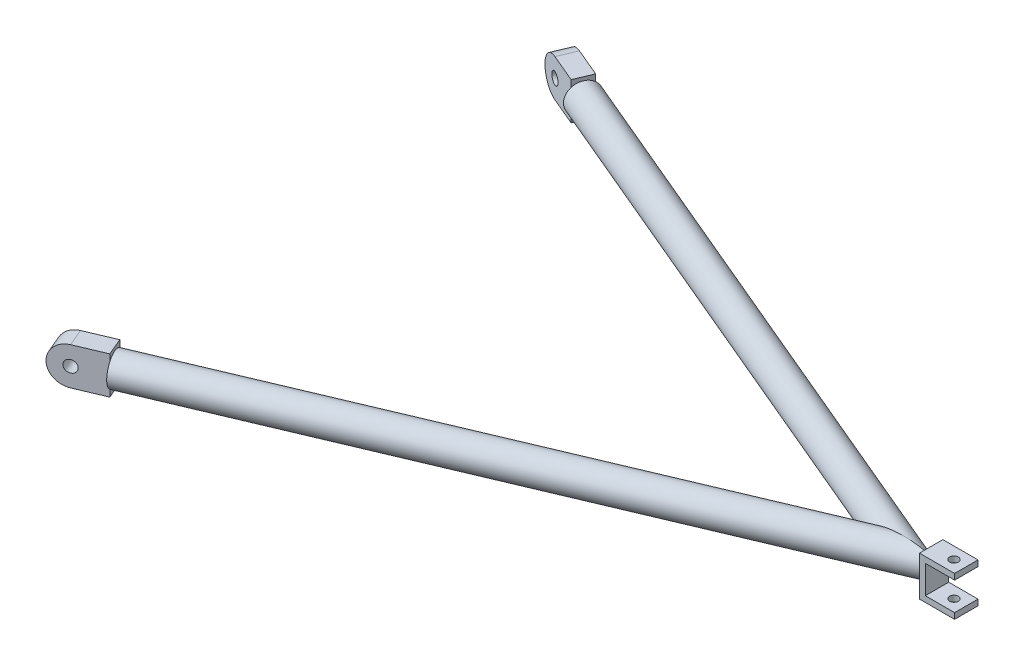
ISO-10303-21;
HEADER;
FILE_DESCRIPTION(('STEP AP214'),'2;1');
FILE_NAME('part.step','',(''),(''),'','','');
FILE_SCHEMA(('AUTOMOTIVE_DESIGN { 1 0 10303 214 1 1 1 1 }'));
ENDSEC;
DATA;
#1=APPLICATION_CONTEXT('core data for automotive mechanical design processes');
#2=APPLICATION_PROTOCOL_DEFINITION('international standard','automotive_design',2000,#1);
#3=PRODUCT_CONTEXT('',#1,'mechanical');
#4=PRODUCT('Part','Part','',(#3));
#5=PRODUCT_RELATED_PRODUCT_CATEGORY('part','',(#4));
#6=PRODUCT_DEFINITION_FORMATION('','',#4);
#7=PRODUCT_DEFINITION_CONTEXT('part definition',#1,'design');
#8=PRODUCT_DEFINITION('design','',#6,#7);
#9=PRODUCT_DEFINITION_SHAPE('','',#8);
#10=(LENGTH_UNIT() NAMED_UNIT(*) SI_UNIT(.MILLI.,.METRE.));
#11=(NAMED_UNIT(*) PLANE_ANGLE_UNIT() SI_UNIT($,.RADIAN.));
#12=(NAMED_UNIT(*) SI_UNIT($,.STERADIAN.) SOLID_ANGLE_UNIT());
#13=UNCERTAINTY_MEASURE_WITH_UNIT(LENGTH_MEASURE(1.E-05),#10,'distance_accuracy_value','');
#14=(GEOMETRIC_REPRESENTATION_CONTEXT(3) GLOBAL_UNCERTAINTY_ASSIGNED_CONTEXT((#13)) GLOBAL_UNIT_ASSIGNED_CONTEXT((#10,
#11,#12)) REPRESENTATION_CONTEXT('',''));
#15=CARTESIAN_POINT('',(0.,0.,0.));
#16=DIRECTION('',(0.,0.,1.));
#17=DIRECTION('',(1.,0.,0.));
#18=AXIS2_PLACEMENT_3D('',#15,#16,#17);
#19=CARTESIAN_POINT('',(-315.908511281352,0.,133.35));
#20=DIRECTION('',(0.921284663987611,0.,-0.388888888888889));
#21=DIRECTION('',(-0.388888888888889,0.,-0.921284663987611));
#22=AXIS2_PLACEMENT_3D('',#19,#20,#21);
#23=CYLINDRICAL_SURFACE('',#22,8.25500000000001);
#24=CARTESIAN_POINT('',(14.8771428571428,0.,-6.27987828486565));
#25=DIRECTION('',(-1.,0.,0.));
#26=DIRECTION('',(0.,0.,-1.));
#27=AXIS2_PLACEMENT_3D('',#24,#25,#26);
#28=ELLIPSE('',#27,8.96031413816198,8.25500000000001);
#29=CARTESIAN_POINT('',(14.8771428571428,5.8883250516238,0.));
#30=VERTEX_POINT('',#29);
#31=CARTESIAN_POINT('',(14.8771428571428,-5.8883250516238,0.));
#32=VERTEX_POINT('',#31);
#33=EDGE_CURVE('E70',#30,#32,#28,.F.);
#34=ORIENTED_EDGE('',*,*,#33,.F.);
#35=CARTESIAN_POINT('',(0.,0.,0.));
#36=DIRECTION('',(0.,0.,-1.));
#37=DIRECTION('',(1.,0.,0.));
#38=AXIS2_PLACEMENT_3D('',#35,#36,#37);
#39=ELLIPSE('',#38,21.2271428571429,8.25500000000001);
#40=EDGE_CURVE('E73',#30,#32,#39,.F.);
#41=ORIENTED_EDGE('',*,*,#40,.T.);
#42=EDGE_LOOP('',(#34,#41));
#43=FACE_BOUND('',#42,.T.);
#44=CARTESIAN_POINT('',(-300.93210778357,0.,127.028222222222));
#45=DIRECTION('',(-0.92128466398761,0.,0.388888888888891));
#46=DIRECTION('',(0.388888888888891,0.,0.92128466398761));
#47=AXIS2_PLACEMENT_3D('',#44,#45,#46);
#48=CIRCLE('',#47,8.25500000000001);
#49=CARTESIAN_POINT('',(-302.907663339125,6.50681373638437,122.348096129165));
#50=VERTEX_POINT('',#49);
#51=CARTESIAN_POINT('',(-298.956552228014,6.50681373638437,131.708348315279));
#52=VERTEX_POINT('',#51);
#53=EDGE_CURVE('E222',#50,#52,#48,.F.);
#54=ORIENTED_EDGE('',*,*,#53,.T.);
#55=CARTESIAN_POINT('',(-300.93210778357,0.,127.028222222222));
#56=DIRECTION('',(-0.92128466398761,0.,0.388888888888891));
#57=DIRECTION('',(0.388888888888891,0.,0.92128466398761));
#58=AXIS2_PLACEMENT_3D('',#55,#56,#57);
#59=CIRCLE('',#58,8.25500000000001);
#60=CARTESIAN_POINT('',(-298.956552228014,-6.50681373638435,131.708348315279));
#61=VERTEX_POINT('',#60);
#62=EDGE_CURVE('E208',#52,#61,#59,.F.);
#63=ORIENTED_EDGE('',*,*,#62,.T.);
#64=CARTESIAN_POINT('',(-302.907663339125,-6.50681373638435,122.348096129165));
#65=VERTEX_POINT('',#64);
#66=EDGE_CURVE('E231',#61,#65,#48,.F.);
#67=ORIENTED_EDGE('',*,*,#66,.T.);
#68=CARTESIAN_POINT('',(-300.93210778357,0.,127.028222222222));
#69=DIRECTION('',(-0.92128466398761,0.,0.388888888888891));
#70=DIRECTION('',(0.388888888888891,0.,0.92128466398761));
#71=AXIS2_PLACEMENT_3D('',#68,#69,#70);
#72=CIRCLE('',#71,8.25500000000001);
#73=EDGE_CURVE('E230',#65,#50,#72,.F.);
#74=ORIENTED_EDGE('',*,*,#73,.T.);
#75=EDGE_LOOP('',(#54,#63,#67,#74));
#76=FACE_BOUND('',#75,.T.);
#77=ADVANCED_FACE('F56',(#43,#76),#23,.T.);
#78=CARTESIAN_POINT('',(19.9106800537004,0.,8.40461428022842));
#79=DIRECTION('',(-0.921284663987611,0.,-0.388888888888889));
#80=DIRECTION('',(-0.388888888888889,0.,0.921284663987611));
#81=AXIS2_PLACEMENT_3D('',#78,#79,#80);
#82=CYLINDRICAL_SURFACE('',#81,8.25500000000001);
#83=CARTESIAN_POINT('',(14.8771428571428,0.,6.27987828486565));
#84=DIRECTION('',(-1.,0.,0.));
#85=DIRECTION('',(0.,0.,-1.));
#86=AXIS2_PLACEMENT_3D('',#83,#84,#85);
#87=ELLIPSE('',#86,8.96031413816199,8.25500000000001);
#88=EDGE_CURVE('E350',#32,#30,#87,.F.);
#89=ORIENTED_EDGE('',*,*,#88,.F.);
#90=ORIENTED_EDGE('',*,*,#40,.F.);
#91=EDGE_LOOP('',(#89,#90));
#92=FACE_BOUND('',#91,.T.);
#93=CARTESIAN_POINT('',(-300.698101478916,0.,-126.929444444444));
#94=DIRECTION('',(-0.92128466398761,0.,-0.388888888888891));
#95=DIRECTION('',(-0.388888888888891,0.,0.92128466398761));
#96=AXIS2_PLACEMENT_3D('',#93,#94,#95);
#97=CIRCLE('',#96,8.25500000000001);
#98=CARTESIAN_POINT('',(-298.722545923361,6.50681373638441,-131.609570537501));
#99=VERTEX_POINT('',#98);
#100=CARTESIAN_POINT('',(-302.673657034472,6.50681373638435,-122.249318351387));
#101=VERTEX_POINT('',#100);
#102=EDGE_CURVE('E233',#99,#101,#97,.F.);
#103=ORIENTED_EDGE('',*,*,#102,.T.);
#104=CARTESIAN_POINT('',(-300.698101478916,0.,-126.929444444444));
#105=DIRECTION('',(-0.92128466398761,0.,-0.388888888888891));
#106=DIRECTION('',(-0.388888888888891,0.,0.92128466398761));
#107=AXIS2_PLACEMENT_3D('',#104,#105,#106);
#108=CIRCLE('',#107,8.25499999999998);
#109=CARTESIAN_POINT('',(-302.673657034472,-6.50681373638431,-122.249318351387));
#110=VERTEX_POINT('',#109);
#111=EDGE_CURVE('E245',#101,#110,#108,.F.);
#112=ORIENTED_EDGE('',*,*,#111,.T.);
#113=CARTESIAN_POINT('',(-298.722545923361,-6.50681373638437,-131.609570537501));
#114=VERTEX_POINT('',#113);
#115=EDGE_CURVE('E64',#110,#114,#97,.F.);
#116=ORIENTED_EDGE('',*,*,#115,.T.);
#117=CARTESIAN_POINT('',(-300.698101478916,0.,-126.929444444444));
#118=DIRECTION('',(-0.92128466398761,0.,-0.388888888888891));
#119=DIRECTION('',(-0.388888888888891,0.,0.92128466398761));
#120=AXIS2_PLACEMENT_3D('',#117,#118,#119);
#121=CIRCLE('',#120,8.25500000000002);
#122=EDGE_CURVE('E207',#114,#99,#121,.F.);
#123=ORIENTED_EDGE('',*,*,#122,.T.);
#124=EDGE_LOOP('',(#103,#112,#116,#123));
#125=FACE_BOUND('',#124,.T.);
#126=ADVANCED_FACE('F58',(#92,#125),#82,.T.);
#127=CARTESIAN_POINT('',(-302.673657034472,10.16,-122.249318351387));
#128=DIRECTION('',(-0.388888888888889,0.,0.921284663987611));
#129=DIRECTION('',(0.921284663987611,0.,0.388888888888889));
#130=AXIS2_PLACEMENT_3D('',#127,#128,#129);
#131=PLANE('',#130);
#132=CARTESIAN_POINT('',(-317.884066836907,0.,-128.669873906943));
#133=DIRECTION('',(-0.388888888888889,0.,0.921284663987611));
#134=DIRECTION('',(0.921284663987611,0.,0.388888888888889));
#135=AXIS2_PLACEMENT_3D('',#132,#133,#134);
#136=CIRCLE('',#135,3.17499999999999);
#137=CARTESIAN_POINT('',(-320.809145645068,0.,-129.904596129165));
#138=VERTEX_POINT('',#137);
#139=EDGE_CURVE('E516',#138,#138,#136,.T.);
#140=ORIENTED_EDGE('',*,*,#139,.F.);
#141=EDGE_LOOP('',(#140));
#142=FACE_BOUND('',#141,.T.);
#143=CARTESIAN_POINT('',(-317.884066836907,0.,-128.669873906943));
#144=DIRECTION('',(-0.388888888888889,0.,0.921284663987611));
#145=DIRECTION('',(0.921284663987611,0.,0.388888888888889));
#146=AXIS2_PLACEMENT_3D('',#143,#144,#145);
#147=CIRCLE('',#146,10.16);
#148=CARTESIAN_POINT('',(-317.884066836907,-10.16,-128.669873906943));
#149=VERTEX_POINT('',#148);
#150=CARTESIAN_POINT('',(-317.884066836907,10.16,-128.669873906943));
#151=VERTEX_POINT('',#150);
#152=EDGE_CURVE('E264',#149,#151,#147,.F.);
#153=ORIENTED_EDGE('',*,*,#152,.F.);
#154=DIRECTION('',(-0.921284663987611,0.,-0.388888888888889));
#155=VECTOR('',#154,1.);
#156=CARTESIAN_POINT('',(-302.673657034472,-10.16,-122.249318351387));
#157=LINE('',#156,#155);
#158=CARTESIAN_POINT('',(-302.673657034472,-10.16,-122.249318351387));
#159=VERTEX_POINT('',#158);
#160=EDGE_CURVE('E226',#159,#149,#157,.T.);
#161=ORIENTED_EDGE('',*,*,#160,.F.);
#162=DIRECTION('',(0.,1.,0.));
#163=VECTOR('',#162,1.);
#164=CARTESIAN_POINT('',(-302.673657034472,10.16,-122.249318351387));
#165=LINE('',#164,#163);
#166=EDGE_CURVE('E252',#159,#110,#165,.T.);
#167=ORIENTED_EDGE('',*,*,#166,.T.);
#168=DIRECTION('',(0.,1.,0.));
#169=VECTOR('',#168,1.);
#170=CARTESIAN_POINT('',(-302.673657034472,6.50681373638435,-122.249318351387));
#171=LINE('',#170,#169);
#172=EDGE_CURVE('E257',#110,#101,#171,.T.);
#173=ORIENTED_EDGE('',*,*,#172,.T.);
#174=CARTESIAN_POINT('',(-302.673657034472,10.16,-122.249318351387));
#175=VERTEX_POINT('',#174);
#176=EDGE_CURVE('E260',#101,#175,#165,.T.);
#177=ORIENTED_EDGE('',*,*,#176,.T.);
#178=DIRECTION('',(-0.921284663987611,0.,-0.388888888888889));
#179=VECTOR('',#178,1.);
#180=CARTESIAN_POINT('',(-302.673657034472,10.16,-122.249318351387));
#181=LINE('',#180,#179);
#182=EDGE_CURVE('E273',#175,#151,#181,.T.);
#183=ORIENTED_EDGE('',*,*,#182,.T.);
#184=EDGE_LOOP('',(#153,#161,#167,#173,#177,#183));
#185=FACE_BOUND('',#184,.T.);
#186=ADVANCED_FACE('F256',(#142,#185),#131,.T.);
#187=CARTESIAN_POINT('',(-298.722545923361,-10.16,-131.609570537501));
#188=DIRECTION('',(0.,-1.,0.));
#189=DIRECTION('',(0.,0.,-1.));
#190=AXIS2_PLACEMENT_3D('',#187,#188,#189);
#191=PLANE('',#190);
#192=ORIENTED_EDGE('',*,*,#160,.T.);
#193=DIRECTION('',(0.388888888888889,0.,-0.921284663987611));
#194=VECTOR('',#193,1.);
#195=CARTESIAN_POINT('',(-416.267828626449,-10.16,104.402999892783));
#196=LINE('',#195,#194);
#197=CARTESIAN_POINT('',(-313.932955725796,-10.16,-138.030126093057));
#198=VERTEX_POINT('',#197);
#199=EDGE_CURVE('E524',#149,#198,#196,.T.);
#200=ORIENTED_EDGE('',*,*,#199,.T.);
#201=DIRECTION('',(-0.921284663987611,0.,-0.388888888888889));
#202=VECTOR('',#201,1.);
#203=CARTESIAN_POINT('',(-298.722545923361,-10.16,-131.609570537501));
#204=LINE('',#203,#202);
#205=CARTESIAN_POINT('',(-298.722545923361,-10.16,-131.609570537501));
#206=VERTEX_POINT('',#205);
#207=EDGE_CURVE('E275',#206,#198,#204,.T.);
#208=ORIENTED_EDGE('',*,*,#207,.F.);
#209=DIRECTION('',(-0.388888888888891,0.,0.92128466398761));
#210=VECTOR('',#209,1.);
#211=CARTESIAN_POINT('',(-298.722545923361,-10.16,-131.609570537501));
#212=LINE('',#211,#210);
#213=EDGE_CURVE('E271',#206,#159,#212,.T.);
#214=ORIENTED_EDGE('',*,*,#213,.T.);
#215=EDGE_LOOP('',(#192,#200,#208,#214));
#216=FACE_BOUND('',#215,.T.);
#217=ADVANCED_FACE('F376',(#216),#191,.T.);
#218=CARTESIAN_POINT('',(-298.722545923361,10.16,-131.609570537501));
#219=DIRECTION('',(0.388888888888889,0.,-0.921284663987611));
#220=DIRECTION('',(-0.921284663987611,0.,-0.388888888888889));
#221=AXIS2_PLACEMENT_3D('',#218,#219,#220);
#222=PLANE('',#221);
#223=CARTESIAN_POINT('',(-313.932955725796,0.,-138.030126093057));
#224=DIRECTION('',(0.388888888888889,0.,-0.921284663987611));
#225=DIRECTION('',(-0.921284663987611,0.,-0.388888888888889));
#226=AXIS2_PLACEMENT_3D('',#223,#224,#225);
#227=CIRCLE('',#226,3.17499999999999);
#228=CARTESIAN_POINT('',(-316.858034533957,0.,-139.264848315279));
#229=VERTEX_POINT('',#228);
#230=EDGE_CURVE('E513',#229,#229,#227,.T.);
#231=ORIENTED_EDGE('',*,*,#230,.F.);
#232=EDGE_LOOP('',(#231));
#233=FACE_BOUND('',#232,.T.);
#234=ORIENTED_EDGE('',*,*,#207,.T.);
#235=CARTESIAN_POINT('',(-313.932955725796,0.,-138.030126093057));
#236=DIRECTION('',(-0.388888888888889,0.,0.921284663987611));
#237=DIRECTION('',(-0.921284663987611,0.,-0.388888888888889));
#238=AXIS2_PLACEMENT_3D('',#235,#236,#237);
#239=CIRCLE('',#238,10.16);
#240=CARTESIAN_POINT('',(-313.932955725796,10.16,-138.030126093057));
#241=VERTEX_POINT('',#240);
#242=EDGE_CURVE('E536',#241,#198,#239,.T.);
#243=ORIENTED_EDGE('',*,*,#242,.F.);
#244=DIRECTION('',(-0.921284663987611,0.,-0.388888888888889));
#245=VECTOR('',#244,1.);
#246=CARTESIAN_POINT('',(-298.722545923361,10.16,-131.609570537501));
#247=LINE('',#246,#245);
#248=CARTESIAN_POINT('',(-298.722545923361,10.16,-131.609570537501));
#249=VERTEX_POINT('',#248);
#250=EDGE_CURVE('E278',#249,#241,#247,.T.);
#251=ORIENTED_EDGE('',*,*,#250,.F.);
#252=DIRECTION('',(0.,-1.,0.));
#253=VECTOR('',#252,1.);
#254=CARTESIAN_POINT('',(-298.722545923361,10.16,-131.609570537501));
#255=LINE('',#254,#253);
#256=EDGE_CURVE('E268',#249,#99,#255,.T.);
#257=ORIENTED_EDGE('',*,*,#256,.T.);
#258=DIRECTION('',(0.,-1.,0.));
#259=VECTOR('',#258,1.);
#260=CARTESIAN_POINT('',(-298.722545923361,-6.50681373638437,-131.609570537501));
#261=LINE('',#260,#259);
#262=EDGE_CURVE('E522',#99,#114,#261,.T.);
#263=ORIENTED_EDGE('',*,*,#262,.T.);
#264=EDGE_CURVE('E254',#114,#206,#255,.T.);
#265=ORIENTED_EDGE('',*,*,#264,.T.);
#266=EDGE_LOOP('',(#234,#243,#251,#257,#263,#265));
#267=FACE_BOUND('',#266,.T.);
#268=ADVANCED_FACE('F425',(#233,#267),#222,.T.);
#269=CARTESIAN_POINT('',(-298.956552228014,10.16,131.708348315279));
#270=DIRECTION('',(0.388888888888889,0.,0.921284663987611));
#271=DIRECTION('',(0.921284663987611,0.,-0.388888888888889));
#272=AXIS2_PLACEMENT_3D('',#269,#270,#271);
#273=PLANE('',#272);
#274=CARTESIAN_POINT('',(-313.932955725797,0.,138.030126093057));
#275=DIRECTION('',(0.388888888888889,0.,0.921284663987611));
#276=DIRECTION('',(0.921284663987611,0.,-0.388888888888889));
#277=AXIS2_PLACEMENT_3D('',#274,#275,#276);
#278=CIRCLE('',#277,3.17499999999999);
#279=CARTESIAN_POINT('',(-311.007876917636,0.,136.795403870835));
#280=VERTEX_POINT('',#279);
#281=EDGE_CURVE('E510',#280,#280,#278,.T.);
#282=ORIENTED_EDGE('',*,*,#281,.F.);
#283=EDGE_LOOP('',(#282));
#284=FACE_BOUND('',#283,.T.);
#285=DIRECTION('',(0.,1.,0.));
#286=VECTOR('',#285,1.);
#287=CARTESIAN_POINT('',(-298.956552228014,6.50681373638437,131.708348315279));
#288=LINE('',#287,#286);
#289=EDGE_CURVE('E196',#61,#52,#288,.T.);
#290=ORIENTED_EDGE('',*,*,#289,.T.);
#291=DIRECTION('',(0.,1.,0.));
#292=VECTOR('',#291,1.);
#293=CARTESIAN_POINT('',(-298.956552228014,10.16,131.708348315279));
#294=LINE('',#293,#292);
#295=CARTESIAN_POINT('',(-298.956552228014,10.16,131.708348315279));
#296=VERTEX_POINT('',#295);
#297=EDGE_CURVE('E201',#52,#296,#294,.T.);
#298=ORIENTED_EDGE('',*,*,#297,.T.);
#299=DIRECTION('',(-0.921284663987611,0.,0.388888888888889));
#300=VECTOR('',#299,1.);
#301=CARTESIAN_POINT('',(-298.956552228014,10.16,131.708348315279));
#302=LINE('',#301,#300);
#303=CARTESIAN_POINT('',(-313.932955725797,10.16,138.030126093057));
#304=VERTEX_POINT('',#303);
#305=EDGE_CURVE('E290',#296,#304,#302,.T.);
#306=ORIENTED_EDGE('',*,*,#305,.T.);
#307=CARTESIAN_POINT('',(-313.932955725797,0.,138.030126093057));
#308=DIRECTION('',(0.388888888888889,0.,0.921284663987611));
#309=DIRECTION('',(0.921284663987611,0.,-0.388888888888889));
#310=AXIS2_PLACEMENT_3D('',#307,#308,#309);
#311=CIRCLE('',#310,10.16);
#312=CARTESIAN_POINT('',(-313.932955725797,-10.16,138.030126093057));
#313=VERTEX_POINT('',#312);
#314=EDGE_CURVE('E534',#304,#313,#311,.T.);
#315=ORIENTED_EDGE('',*,*,#314,.T.);
#316=DIRECTION('',(-0.921284663987611,0.,0.388888888888889));
#317=VECTOR('',#316,1.);
#318=CARTESIAN_POINT('',(-298.956552228014,-10.16,131.708348315279));
#319=LINE('',#318,#317);
#320=CARTESIAN_POINT('',(-298.956552228014,-10.16,131.708348315279));
#321=VERTEX_POINT('',#320);
#322=EDGE_CURVE('E291',#321,#313,#319,.T.);
#323=ORIENTED_EDGE('',*,*,#322,.F.);
#324=EDGE_CURVE('E204',#321,#61,#294,.T.);
#325=ORIENTED_EDGE('',*,*,#324,.T.);
#326=EDGE_LOOP('',(#290,#298,#306,#315,#323,#325));
#327=FACE_BOUND('',#326,.T.);
#328=ADVANCED_FACE('F198',(#284,#327),#273,.T.);
#329=CARTESIAN_POINT('',(-302.907663339125,10.16,122.348096129165));
#330=DIRECTION('',(-0.388888888888889,0.,-0.921284663987611));
#331=DIRECTION('',(-0.921284663987611,0.,0.388888888888889));
#332=AXIS2_PLACEMENT_3D('',#329,#330,#331);
#333=PLANE('',#332);
#334=CARTESIAN_POINT('',(-317.884066836908,0.,128.669873906943));
#335=DIRECTION('',(-0.388888888888889,0.,-0.921284663987611));
#336=DIRECTION('',(-0.921284663987611,0.,0.388888888888889));
#337=AXIS2_PLACEMENT_3D('',#334,#335,#336);
#338=CIRCLE('',#337,3.17499999999999);
#339=CARTESIAN_POINT('',(-320.809145645068,0.,129.904596129165));
#340=VERTEX_POINT('',#339);
#341=EDGE_CURVE('E507',#340,#340,#338,.T.);
#342=ORIENTED_EDGE('',*,*,#341,.F.);
#343=EDGE_LOOP('',(#342));
#344=FACE_BOUND('',#343,.T.);
#345=DIRECTION('',(0.,-1.,0.));
#346=VECTOR('',#345,1.);
#347=CARTESIAN_POINT('',(-302.907663339125,-6.50681373638435,122.348096129165));
#348=LINE('',#347,#346);
#349=EDGE_CURVE('E215',#50,#65,#348,.T.);
#350=ORIENTED_EDGE('',*,*,#349,.T.);
#351=DIRECTION('',(0.,-1.,0.));
#352=VECTOR('',#351,1.);
#353=CARTESIAN_POINT('',(-302.907663339125,10.16,122.348096129165));
#354=LINE('',#353,#352);
#355=CARTESIAN_POINT('',(-302.907663339125,-10.16,122.348096129165));
#356=VERTEX_POINT('',#355);
#357=EDGE_CURVE('E284',#65,#356,#354,.T.);
#358=ORIENTED_EDGE('',*,*,#357,.T.);
#359=DIRECTION('',(-0.921284663987611,0.,0.388888888888889));
#360=VECTOR('',#359,1.);
#361=CARTESIAN_POINT('',(-302.907663339125,-10.16,122.348096129165));
#362=LINE('',#361,#360);
#363=CARTESIAN_POINT('',(-317.884066836908,-10.16,128.669873906943));
#364=VERTEX_POINT('',#363);
#365=EDGE_CURVE('E295',#356,#364,#362,.T.);
#366=ORIENTED_EDGE('',*,*,#365,.T.);
#367=CARTESIAN_POINT('',(-317.884066836908,0.,128.669873906943));
#368=DIRECTION('',(-0.388888888888889,0.,-0.921284663987611));
#369=DIRECTION('',(-0.921284663987611,0.,0.388888888888889));
#370=AXIS2_PLACEMENT_3D('',#367,#368,#369);
#371=CIRCLE('',#370,10.16);
#372=CARTESIAN_POINT('',(-317.884066836908,10.16,128.669873906943));
#373=VERTEX_POINT('',#372);
#374=EDGE_CURVE('E529',#364,#373,#371,.T.);
#375=ORIENTED_EDGE('',*,*,#374,.T.);
#376=DIRECTION('',(-0.921284663987611,0.,0.388888888888889));
#377=VECTOR('',#376,1.);
#378=CARTESIAN_POINT('',(-302.907663339125,10.16,122.348096129165));
#379=LINE('',#378,#377);
#380=CARTESIAN_POINT('',(-302.907663339125,10.16,122.348096129165));
#381=VERTEX_POINT('',#380);
#382=EDGE_CURVE('E298',#381,#373,#379,.T.);
#383=ORIENTED_EDGE('',*,*,#382,.F.);
#384=EDGE_CURVE('E285',#381,#50,#354,.T.);
#385=ORIENTED_EDGE('',*,*,#384,.T.);
#386=EDGE_LOOP('',(#350,#358,#366,#375,#383,#385));
#387=FACE_BOUND('',#386,.T.);
#388=ADVANCED_FACE('F424',(#344,#387),#333,.T.);
#389=CARTESIAN_POINT('',(-302.907663339125,-10.16,122.348096129165));
#390=DIRECTION('',(0.,-1.,0.));
#391=DIRECTION('',(0.,0.,-1.));
#392=AXIS2_PLACEMENT_3D('',#389,#390,#391);
#393=PLANE('',#392);
#394=ORIENTED_EDGE('',*,*,#322,.T.);
#395=DIRECTION('',(-0.388888888888889,0.,-0.921284663987611));
#396=VECTOR('',#395,1.);
#397=CARTESIAN_POINT('',(-259.908193063153,-10.16,266.015745478765));
#398=LINE('',#397,#396);
#399=EDGE_CURVE('E12',#313,#364,#398,.T.);
#400=ORIENTED_EDGE('',*,*,#399,.T.);
#401=ORIENTED_EDGE('',*,*,#365,.F.);
#402=DIRECTION('',(0.388888888888891,0.,0.92128466398761));
#403=VECTOR('',#402,1.);
#404=CARTESIAN_POINT('',(-302.907663339125,-10.16,122.348096129165));
#405=LINE('',#404,#403);
#406=EDGE_CURVE('E287',#356,#321,#405,.T.);
#407=ORIENTED_EDGE('',*,*,#406,.T.);
#408=EDGE_LOOP('',(#394,#400,#401,#407));
#409=FACE_BOUND('',#408,.T.);
#410=ADVANCED_FACE('F433',(#409),#393,.T.);
#411=CARTESIAN_POINT('',(-298.722545923361,10.16,-131.609570537501));
#412=DIRECTION('',(0.,1.,0.));
#413=DIRECTION('',(0.,0.,1.));
#414=AXIS2_PLACEMENT_3D('',#411,#412,#413);
#415=PLANE('',#414);
#416=ORIENTED_EDGE('',*,*,#250,.T.);
#417=DIRECTION('',(0.388888888888889,0.,-0.921284663987611));
#418=VECTOR('',#417,1.);
#419=CARTESIAN_POINT('',(-416.267828626449,10.16,104.402999892783));
#420=LINE('',#419,#418);
#421=EDGE_CURVE('E537',#151,#241,#420,.T.);
#422=ORIENTED_EDGE('',*,*,#421,.F.);
#423=ORIENTED_EDGE('',*,*,#182,.F.);
#424=DIRECTION('',(0.388888888888891,0.,-0.92128466398761));
#425=VECTOR('',#424,1.);
#426=CARTESIAN_POINT('',(-298.722545923361,10.16,-131.609570537501));
#427=LINE('',#426,#425);
#428=EDGE_CURVE('E259',#175,#249,#427,.T.);
#429=ORIENTED_EDGE('',*,*,#428,.T.);
#430=EDGE_LOOP('',(#416,#422,#423,#429));
#431=FACE_BOUND('',#430,.T.);
#432=ADVANCED_FACE('F386',(#431),#415,.T.);
#433=CARTESIAN_POINT('',(33.9317533676103,7.62,-6.35));
#434=DIRECTION('',(1.,0.,0.));
#435=DIRECTION('',(0.,0.,-1.));
#436=AXIS2_PLACEMENT_3D('',#433,#434,#435);
#437=PLANE('',#436);
#438=DIRECTION('',(0.,0.,1.));
#439=VECTOR('',#438,1.);
#440=CARTESIAN_POINT('',(33.9317533676103,10.795,-6.35));
#441=LINE('',#440,#439);
#442=CARTESIAN_POINT('',(33.9317533676103,10.795,-6.35));
#443=VERTEX_POINT('',#442);
#444=CARTESIAN_POINT('',(33.9317533676103,10.795,6.35));
#445=VERTEX_POINT('',#444);
#446=EDGE_CURVE('E347',#443,#445,#441,.T.);
#447=ORIENTED_EDGE('',*,*,#446,.T.);
#448=DIRECTION('',(0.,1.,0.));
#449=VECTOR('',#448,1.);
#450=CARTESIAN_POINT('',(33.9317533676103,7.62,6.35));
#451=LINE('',#450,#449);
#452=CARTESIAN_POINT('',(33.9317533676103,7.62,6.35));
#453=VERTEX_POINT('',#452);
#454=EDGE_CURVE('E294',#453,#445,#451,.T.);
#455=ORIENTED_EDGE('',*,*,#454,.F.);
#456=DIRECTION('',(0.,0.,1.));
#457=VECTOR('',#456,1.);
#458=CARTESIAN_POINT('',(33.9317533676103,7.62,-6.35));
#459=LINE('',#458,#457);
#460=CARTESIAN_POINT('',(33.9317533676103,7.62,-6.35));
#461=VERTEX_POINT('',#460);
#462=EDGE_CURVE('E348',#461,#453,#459,.T.);
#463=ORIENTED_EDGE('',*,*,#462,.F.);
#464=DIRECTION('',(0.,1.,0.));
#465=VECTOR('',#464,1.);
#466=CARTESIAN_POINT('',(33.9317533676103,7.62,-6.35));
#467=LINE('',#466,#465);
#468=EDGE_CURVE('E324',#461,#443,#467,.T.);
#469=ORIENTED_EDGE('',*,*,#468,.T.);
#470=EDGE_LOOP('',(#447,#455,#463,#469));
#471=FACE_BOUND('',#470,.T.);
#472=ADVANCED_FACE('F382',(#471),#437,.T.);
#473=CARTESIAN_POINT('',(18.0521428571428,7.62,-6.35));
#474=DIRECTION('',(0.,-1.,0.));
#475=DIRECTION('',(1.,0.,0.));
#476=AXIS2_PLACEMENT_3D('',#473,#474,#475);
#477=PLANE('',#476);
#478=CARTESIAN_POINT('',(27.2392190002346,7.62,0.));
#479=DIRECTION('',(0.,-1.,0.));
#480=DIRECTION('',(1.,0.,0.));
#481=AXIS2_PLACEMENT_3D('',#478,#479,#480);
#482=CIRCLE('',#481,2.38125);
#483=CARTESIAN_POINT('',(29.6204690002346,7.62,0.));
#484=VERTEX_POINT('',#483);
#485=EDGE_CURVE('E500',#484,#484,#482,.T.);
#486=ORIENTED_EDGE('',*,*,#485,.F.);
#487=EDGE_LOOP('',(#486));
#488=FACE_BOUND('',#487,.T.);
#489=ORIENTED_EDGE('',*,*,#462,.T.);
#490=DIRECTION('',(1.,0.,0.));
#491=VECTOR('',#490,1.);
#492=CARTESIAN_POINT('',(18.0521428571428,7.62,6.35));
#493=LINE('',#492,#491);
#494=CARTESIAN_POINT('',(18.0521428571428,7.62,6.35));
#495=VERTEX_POINT('',#494);
#496=EDGE_CURVE('E321',#495,#453,#493,.T.);
#497=ORIENTED_EDGE('',*,*,#496,.F.);
#498=DIRECTION('',(0.,0.,1.));
#499=VECTOR('',#498,1.);
#500=CARTESIAN_POINT('',(18.0521428571428,7.62,-6.35));
#501=LINE('',#500,#499);
#502=CARTESIAN_POINT('',(18.0521428571428,7.62,-6.35));
#503=VERTEX_POINT('',#502);
#504=EDGE_CURVE('E351',#503,#495,#501,.T.);
#505=ORIENTED_EDGE('',*,*,#504,.F.);
#506=DIRECTION('',(1.,0.,0.));
#507=VECTOR('',#506,1.);
#508=CARTESIAN_POINT('',(18.0521428571428,7.62,-6.35));
#509=LINE('',#508,#507);
#510=EDGE_CURVE('E344',#503,#461,#509,.T.);
#511=ORIENTED_EDGE('',*,*,#510,.T.);
#512=EDGE_LOOP('',(#489,#497,#505,#511));
#513=FACE_BOUND('',#512,.T.);
#514=ADVANCED_FACE('F385',(#488,#513),#477,.T.);
#515=CARTESIAN_POINT('',(18.0521428571428,-7.62,-6.35));
#516=DIRECTION('',(1.,0.,0.));
#517=DIRECTION('',(0.,1.,0.));
#518=AXIS2_PLACEMENT_3D('',#515,#516,#517);
#519=PLANE('',#518);
#520=ORIENTED_EDGE('',*,*,#504,.T.);
#521=DIRECTION('',(0.,1.,0.));
#522=VECTOR('',#521,1.);
#523=CARTESIAN_POINT('',(18.0521428571428,-7.62,6.35));
#524=LINE('',#523,#522);
#525=CARTESIAN_POINT('',(18.0521428571428,-7.62,6.35));
#526=VERTEX_POINT('',#525);
#527=EDGE_CURVE('E319',#526,#495,#524,.T.);
#528=ORIENTED_EDGE('',*,*,#527,.F.);
#529=DIRECTION('',(0.,0.,1.));
#530=VECTOR('',#529,1.);
#531=CARTESIAN_POINT('',(18.0521428571428,-7.62,-6.35));
#532=LINE('',#531,#530);
#533=CARTESIAN_POINT('',(18.0521428571428,-7.62,-6.35));
#534=VERTEX_POINT('',#533);
#535=EDGE_CURVE('E354',#534,#526,#532,.T.);
#536=ORIENTED_EDGE('',*,*,#535,.F.);
#537=DIRECTION('',(0.,1.,0.));
#538=VECTOR('',#537,1.);
#539=CARTESIAN_POINT('',(18.0521428571428,-7.62,-6.35));
#540=LINE('',#539,#538);
#541=EDGE_CURVE('E342',#534,#503,#540,.T.);
#542=ORIENTED_EDGE('',*,*,#541,.T.);
#543=EDGE_LOOP('',(#520,#528,#536,#542));
#544=FACE_BOUND('',#543,.T.);
#545=ADVANCED_FACE('F406',(#544),#519,.T.);
#546=CARTESIAN_POINT('',(33.9317533676103,-7.62,-6.35));
#547=DIRECTION('',(0.,1.,0.));
#548=DIRECTION('',(-1.,0.,0.));
#549=AXIS2_PLACEMENT_3D('',#546,#547,#548);
#550=PLANE('',#549);
#551=CARTESIAN_POINT('',(27.2392190002346,-7.62,0.));
#552=DIRECTION('',(0.,1.,0.));
#553=DIRECTION('',(-1.,0.,0.));
#554=AXIS2_PLACEMENT_3D('',#551,#552,#553);
#555=CIRCLE('',#554,2.38125);
#556=CARTESIAN_POINT('',(24.8579690002346,-7.62,0.));
#557=VERTEX_POINT('',#556);
#558=EDGE_CURVE('E494',#557,#557,#555,.T.);
#559=ORIENTED_EDGE('',*,*,#558,.F.);
#560=EDGE_LOOP('',(#559));
#561=FACE_BOUND('',#560,.T.);
#562=ORIENTED_EDGE('',*,*,#535,.T.);
#563=DIRECTION('',(-1.,0.,0.));
#564=VECTOR('',#563,1.);
#565=CARTESIAN_POINT('',(33.9317533676103,-7.62,6.35));
#566=LINE('',#565,#564);
#567=CARTESIAN_POINT('',(33.9317533676103,-7.62,6.35));
#568=VERTEX_POINT('',#567);
#569=EDGE_CURVE('E316',#568,#526,#566,.T.);
#570=ORIENTED_EDGE('',*,*,#569,.F.);
#571=DIRECTION('',(0.,0.,1.));
#572=VECTOR('',#571,1.);
#573=CARTESIAN_POINT('',(33.9317533676103,-7.62,-6.35));
#574=LINE('',#573,#572);
#575=CARTESIAN_POINT('',(33.9317533676103,-7.62,-6.35));
#576=VERTEX_POINT('',#575);
#577=EDGE_CURVE('E356',#576,#568,#574,.T.);
#578=ORIENTED_EDGE('',*,*,#577,.F.);
#579=DIRECTION('',(-1.,0.,0.));
#580=VECTOR('',#579,1.);
#581=CARTESIAN_POINT('',(33.9317533676103,-7.62,-6.35));
#582=LINE('',#581,#580);
#583=EDGE_CURVE('E339',#576,#534,#582,.T.);
#584=ORIENTED_EDGE('',*,*,#583,.T.);
#585=EDGE_LOOP('',(#562,#570,#578,#584));
#586=FACE_BOUND('',#585,.T.);
#587=ADVANCED_FACE('F402',(#561,#586),#550,.T.);
#588=CARTESIAN_POINT('',(33.9317533676103,-10.795,-6.35));
#589=DIRECTION('',(1.,0.,0.));
#590=DIRECTION('',(0.,0.,-1.));
#591=AXIS2_PLACEMENT_3D('',#588,#589,#590);
#592=PLANE('',#591);
#593=ORIENTED_EDGE('',*,*,#577,.T.);
#594=DIRECTION('',(0.,1.,0.));
#595=VECTOR('',#594,1.);
#596=CARTESIAN_POINT('',(33.9317533676103,-10.795,6.35));
#597=LINE('',#596,#595);
#598=CARTESIAN_POINT('',(33.9317533676103,-10.795,6.35));
#599=VERTEX_POINT('',#598);
#600=EDGE_CURVE('E313',#599,#568,#597,.T.);
#601=ORIENTED_EDGE('',*,*,#600,.F.);
#602=DIRECTION('',(0.,0.,1.));
#603=VECTOR('',#602,1.);
#604=CARTESIAN_POINT('',(33.9317533676103,-10.795,-6.35));
#605=LINE('',#604,#603);
#606=CARTESIAN_POINT('',(33.9317533676103,-10.795,-6.35));
#607=VERTEX_POINT('',#606);
#608=EDGE_CURVE('E358',#607,#599,#605,.T.);
#609=ORIENTED_EDGE('',*,*,#608,.F.);
#610=DIRECTION('',(0.,1.,0.));
#611=VECTOR('',#610,1.);
#612=CARTESIAN_POINT('',(33.9317533676103,-10.795,-6.35));
#613=LINE('',#612,#611);
#614=EDGE_CURVE('E336',#607,#576,#613,.T.);
#615=ORIENTED_EDGE('',*,*,#614,.T.);
#616=EDGE_LOOP('',(#593,#601,#609,#615));
#617=FACE_BOUND('',#616,.T.);
#618=ADVANCED_FACE('F398',(#617),#592,.T.);
#619=CARTESIAN_POINT('',(14.8771428571428,-10.795,-6.35));
#620=DIRECTION('',(0.,-1.,0.));
#621=DIRECTION('',(0.,0.,-1.));
#622=AXIS2_PLACEMENT_3D('',#619,#620,#621);
#623=PLANE('',#622);
#624=CARTESIAN_POINT('',(27.2392190002346,-10.795,0.));
#625=DIRECTION('',(0.,1.,0.));
#626=DIRECTION('',(0.,0.,1.));
#627=AXIS2_PLACEMENT_3D('',#624,#625,#626);
#628=CIRCLE('',#627,2.38124999999999);
#629=CARTESIAN_POINT('',(27.2392190002346,-10.795,2.38124999999999));
#630=VERTEX_POINT('',#629);
#631=EDGE_CURVE('E497',#630,#630,#628,.T.);
#632=ORIENTED_EDGE('',*,*,#631,.T.);
#633=EDGE_LOOP('',(#632));
#634=FACE_BOUND('',#633,.T.);
#635=ORIENTED_EDGE('',*,*,#608,.T.);
#636=DIRECTION('',(1.,0.,0.));
#637=VECTOR('',#636,1.);
#638=CARTESIAN_POINT('',(14.8771428571428,-10.795,6.35));
#639=LINE('',#638,#637);
#640=CARTESIAN_POINT('',(14.8771428571428,-10.795,6.35));
#641=VERTEX_POINT('',#640);
#642=EDGE_CURVE('E310',#641,#599,#639,.T.);
#643=ORIENTED_EDGE('',*,*,#642,.F.);
#644=DIRECTION('',(0.,0.,1.));
#645=VECTOR('',#644,1.);
#646=CARTESIAN_POINT('',(14.8771428571428,-10.795,-6.35));
#647=LINE('',#646,#645);
#648=CARTESIAN_POINT('',(14.8771428571428,-10.795,-6.35));
#649=VERTEX_POINT('',#648);
#650=EDGE_CURVE('E360',#649,#641,#647,.T.);
#651=ORIENTED_EDGE('',*,*,#650,.F.);
#652=DIRECTION('',(1.,0.,0.));
#653=VECTOR('',#652,1.);
#654=CARTESIAN_POINT('',(14.8771428571428,-10.795,-6.35));
#655=LINE('',#654,#653);
#656=EDGE_CURVE('E333',#649,#607,#655,.T.);
#657=ORIENTED_EDGE('',*,*,#656,.T.);
#658=EDGE_LOOP('',(#635,#643,#651,#657));
#659=FACE_BOUND('',#658,.T.);
#660=ADVANCED_FACE('F395',(#634,#659),#623,.T.);
#661=CARTESIAN_POINT('',(14.8771428571428,10.795,-6.35));
#662=DIRECTION('',(-1.,0.,0.));
#663=DIRECTION('',(0.,-1.,0.));
#664=AXIS2_PLACEMENT_3D('',#661,#662,#663);
#665=PLANE('',#664);
#666=ORIENTED_EDGE('',*,*,#33,.T.);
#667=ORIENTED_EDGE('',*,*,#88,.T.);
#668=EDGE_LOOP('',(#666,#667));
#669=FACE_BOUND('',#668,.T.);
#670=ORIENTED_EDGE('',*,*,#650,.T.);
#671=DIRECTION('',(0.,-1.,0.));
#672=VECTOR('',#671,1.);
#673=CARTESIAN_POINT('',(14.8771428571428,10.795,6.35));
#674=LINE('',#673,#672);
#675=CARTESIAN_POINT('',(14.8771428571428,10.795,6.35));
#676=VERTEX_POINT('',#675);
#677=EDGE_CURVE('E307',#676,#641,#674,.T.);
#678=ORIENTED_EDGE('',*,*,#677,.F.);
#679=DIRECTION('',(0.,0.,1.));
#680=VECTOR('',#679,1.);
#681=CARTESIAN_POINT('',(14.8771428571428,10.795,-6.35));
#682=LINE('',#681,#680);
#683=CARTESIAN_POINT('',(14.8771428571428,10.795,-6.35));
#684=VERTEX_POINT('',#683);
#685=EDGE_CURVE('E362',#684,#676,#682,.T.);
#686=ORIENTED_EDGE('',*,*,#685,.F.);
#687=DIRECTION('',(0.,-1.,0.));
#688=VECTOR('',#687,1.);
#689=CARTESIAN_POINT('',(14.8771428571428,10.795,-6.35));
#690=LINE('',#689,#688);
#691=EDGE_CURVE('E330',#684,#649,#690,.T.);
#692=ORIENTED_EDGE('',*,*,#691,.T.);
#693=EDGE_LOOP('',(#670,#678,#686,#692));
#694=FACE_BOUND('',#693,.T.);
#695=ADVANCED_FACE('F367',(#669,#694),#665,.T.);
#696=CARTESIAN_POINT('',(33.9317533676103,10.795,-6.35));
#697=DIRECTION('',(0.,1.,0.));
#698=DIRECTION('',(-1.,0.,0.));
#699=AXIS2_PLACEMENT_3D('',#696,#697,#698);
#700=PLANE('',#699);
#701=CARTESIAN_POINT('',(27.2392190002346,10.795,0.));
#702=DIRECTION('',(0.,1.,0.));
#703=DIRECTION('',(0.,0.,1.));
#704=AXIS2_PLACEMENT_3D('',#701,#702,#703);
#705=CIRCLE('',#704,2.38125);
#706=CARTESIAN_POINT('',(27.2392190002346,10.795,2.38125));
#707=VERTEX_POINT('',#706);
#708=EDGE_CURVE('E498',#707,#707,#705,.T.);
#709=ORIENTED_EDGE('',*,*,#708,.F.);
#710=EDGE_LOOP('',(#709));
#711=FACE_BOUND('',#710,.T.);
#712=ORIENTED_EDGE('',*,*,#685,.T.);
#713=DIRECTION('',(-1.,0.,0.));
#714=VECTOR('',#713,1.);
#715=CARTESIAN_POINT('',(33.9317533676103,10.795,6.35));
#716=LINE('',#715,#714);
#717=EDGE_CURVE('E304',#445,#676,#716,.T.);
#718=ORIENTED_EDGE('',*,*,#717,.F.);
#719=ORIENTED_EDGE('',*,*,#446,.F.);
#720=DIRECTION('',(-1.,0.,0.));
#721=VECTOR('',#720,1.);
#722=CARTESIAN_POINT('',(33.9317533676103,10.795,-6.35));
#723=LINE('',#722,#721);
#724=EDGE_CURVE('E327',#443,#684,#723,.T.);
#725=ORIENTED_EDGE('',*,*,#724,.T.);
#726=EDGE_LOOP('',(#712,#718,#719,#725));
#727=FACE_BOUND('',#726,.T.);
#728=ADVANCED_FACE('F388',(#711,#727),#700,.T.);
#729=CARTESIAN_POINT('',(0.,0.,-6.35));
#730=DIRECTION('',(0.,0.,1.));
#731=DIRECTION('',(1.,0.,0.));
#732=AXIS2_PLACEMENT_3D('',#729,#730,#731);
#733=PLANE('',#732);
#734=ORIENTED_EDGE('',*,*,#468,.F.);
#735=ORIENTED_EDGE('',*,*,#510,.F.);
#736=ORIENTED_EDGE('',*,*,#541,.F.);
#737=ORIENTED_EDGE('',*,*,#583,.F.);
#738=ORIENTED_EDGE('',*,*,#614,.F.);
#739=ORIENTED_EDGE('',*,*,#656,.F.);
#740=ORIENTED_EDGE('',*,*,#691,.F.);
#741=ORIENTED_EDGE('',*,*,#724,.F.);
#742=EDGE_LOOP('',(#734,#735,#736,#737,#738,#739,#740,#741));
#743=FACE_BOUND('',#742,.T.);
#744=ADVANCED_FACE('F391',(#743),#733,.F.);
#745=CARTESIAN_POINT('',(0.,0.,6.35));
#746=DIRECTION('',(0.,0.,1.));
#747=DIRECTION('',(1.,0.,0.));
#748=AXIS2_PLACEMENT_3D('',#745,#746,#747);
#749=PLANE('',#748);
#750=ORIENTED_EDGE('',*,*,#454,.T.);
#751=ORIENTED_EDGE('',*,*,#717,.T.);
#752=ORIENTED_EDGE('',*,*,#677,.T.);
#753=ORIENTED_EDGE('',*,*,#642,.T.);
#754=ORIENTED_EDGE('',*,*,#600,.T.);
#755=ORIENTED_EDGE('',*,*,#569,.T.);
#756=ORIENTED_EDGE('',*,*,#527,.T.);
#757=ORIENTED_EDGE('',*,*,#496,.T.);
#758=EDGE_LOOP('',(#750,#751,#752,#753,#754,#755,#756,#757));
#759=FACE_BOUND('',#758,.T.);
#760=ADVANCED_FACE('F416',(#759),#749,.T.);
#761=CARTESIAN_POINT('',(-300.932107783569,0.,127.028222222223));
#762=DIRECTION('',(-0.92128466398761,0.,0.388888888888891));
#763=DIRECTION('',(0.388888888888891,0.,0.92128466398761));
#764=AXIS2_PLACEMENT_3D('',#761,#762,#763);
#765=PLANE('',#764);
#766=ORIENTED_EDGE('',*,*,#66,.F.);
#767=ORIENTED_EDGE('',*,*,#324,.F.);
#768=ORIENTED_EDGE('',*,*,#406,.F.);
#769=ORIENTED_EDGE('',*,*,#357,.F.);
#770=EDGE_LOOP('',(#766,#767,#768,#769));
#771=FACE_BOUND('',#770,.T.);
#772=ADVANCED_FACE('F420',(#771),#765,.F.);
#773=CARTESIAN_POINT('',(-302.907663339125,10.16,122.348096129165));
#774=DIRECTION('',(0.,1.,0.));
#775=DIRECTION('',(0.,0.,1.));
#776=AXIS2_PLACEMENT_3D('',#773,#774,#775);
#777=PLANE('',#776);
#778=DIRECTION('',(-0.388888888888889,0.,-0.921284663987611));
#779=VECTOR('',#778,1.);
#780=CARTESIAN_POINT('',(-259.908193063153,10.16,266.015745478765));
#781=LINE('',#780,#779);
#782=EDGE_CURVE('E532',#304,#373,#781,.T.);
#783=ORIENTED_EDGE('',*,*,#782,.F.);
#784=ORIENTED_EDGE('',*,*,#305,.F.);
#785=DIRECTION('',(-0.388888888888891,0.,-0.92128466398761));
#786=VECTOR('',#785,1.);
#787=CARTESIAN_POINT('',(-302.907663339125,10.16,122.348096129165));
#788=LINE('',#787,#786);
#789=EDGE_CURVE('E225',#296,#381,#788,.T.);
#790=ORIENTED_EDGE('',*,*,#789,.T.);
#791=ORIENTED_EDGE('',*,*,#382,.T.);
#792=EDGE_LOOP('',(#783,#784,#790,#791));
#793=FACE_BOUND('',#792,.T.);
#794=ADVANCED_FACE('F427',(#793),#777,.T.);
#795=ORIENTED_EDGE('',*,*,#53,.F.);
#796=ORIENTED_EDGE('',*,*,#384,.F.);
#797=ORIENTED_EDGE('',*,*,#789,.F.);
#798=ORIENTED_EDGE('',*,*,#297,.F.);
#799=EDGE_LOOP('',(#795,#796,#797,#798));
#800=FACE_BOUND('',#799,.T.);
#801=ADVANCED_FACE('F220',(#800),#765,.F.);
#802=CARTESIAN_POINT('',(-300.698101478916,0.,-126.929444444445));
#803=DIRECTION('',(-0.92128466398761,0.,-0.388888888888891));
#804=DIRECTION('',(-0.388888888888891,0.,0.92128466398761));
#805=AXIS2_PLACEMENT_3D('',#802,#803,#804);
#806=PLANE('',#805);
#807=ORIENTED_EDGE('',*,*,#115,.F.);
#808=ORIENTED_EDGE('',*,*,#166,.F.);
#809=ORIENTED_EDGE('',*,*,#213,.F.);
#810=ORIENTED_EDGE('',*,*,#264,.F.);
#811=EDGE_LOOP('',(#807,#808,#809,#810));
#812=FACE_BOUND('',#811,.T.);
#813=ADVANCED_FACE('F250',(#812),#806,.F.);
#814=ORIENTED_EDGE('',*,*,#102,.F.);
#815=ORIENTED_EDGE('',*,*,#256,.F.);
#816=ORIENTED_EDGE('',*,*,#428,.F.);
#817=ORIENTED_EDGE('',*,*,#176,.F.);
#818=EDGE_LOOP('',(#814,#815,#816,#817));
#819=FACE_BOUND('',#818,.T.);
#820=ADVANCED_FACE('F449',(#819),#806,.F.);
#821=CARTESIAN_POINT('',(-416.267828626449,0.,104.402999892783));
#822=DIRECTION('',(0.388888888888889,0.,-0.921284663987611));
#823=DIRECTION('',(-0.921284663987611,0.,-0.388888888888889));
#824=AXIS2_PLACEMENT_3D('',#821,#822,#823);
#825=CYLINDRICAL_SURFACE('',#824,10.16);
#826=ORIENTED_EDGE('',*,*,#152,.T.);
#827=ORIENTED_EDGE('',*,*,#421,.T.);
#828=ORIENTED_EDGE('',*,*,#242,.T.);
#829=ORIENTED_EDGE('',*,*,#199,.F.);
#830=EDGE_LOOP('',(#826,#827,#828,#829));
#831=FACE_BOUND('',#830,.T.);
#832=ADVANCED_FACE('F452',(#831),#825,.T.);
#833=CARTESIAN_POINT('',(-259.908193063153,0.,266.015745478765));
#834=DIRECTION('',(-0.388888888888889,0.,-0.921284663987611));
#835=DIRECTION('',(-0.921284663987611,0.,0.388888888888889));
#836=AXIS2_PLACEMENT_3D('',#833,#834,#835);
#837=CYLINDRICAL_SURFACE('',#836,10.16);
#838=ORIENTED_EDGE('',*,*,#782,.T.);
#839=ORIENTED_EDGE('',*,*,#374,.F.);
#840=ORIENTED_EDGE('',*,*,#399,.F.);
#841=ORIENTED_EDGE('',*,*,#314,.F.);
#842=EDGE_LOOP('',(#838,#839,#840,#841));
#843=FACE_BOUND('',#842,.T.);
#844=ADVANCED_FACE('F456',(#843),#837,.T.);
#845=CARTESIAN_POINT('',(-300.698101478916,0.,-126.929444444445));
#846=DIRECTION('',(-0.92128466398761,0.,-0.388888888888891));
#847=DIRECTION('',(-0.388888888888891,0.,0.92128466398761));
#848=AXIS2_PLACEMENT_3D('',#845,#846,#847);
#849=PLANE('',#848);
#850=ORIENTED_EDGE('',*,*,#122,.F.);
#851=ORIENTED_EDGE('',*,*,#262,.F.);
#852=EDGE_LOOP('',(#850,#851));
#853=FACE_BOUND('',#852,.T.);
#854=ADVANCED_FACE('F460',(#853),#849,.T.);
#855=CARTESIAN_POINT('',(-300.698101478916,0.,-126.929444444445));
#856=DIRECTION('',(-0.92128466398761,0.,-0.388888888888891));
#857=DIRECTION('',(-0.388888888888891,0.,0.92128466398761));
#858=AXIS2_PLACEMENT_3D('',#855,#856,#857);
#859=PLANE('',#858);
#860=ORIENTED_EDGE('',*,*,#111,.F.);
#861=ORIENTED_EDGE('',*,*,#172,.F.);
#862=EDGE_LOOP('',(#860,#861));
#863=FACE_BOUND('',#862,.T.);
#864=ADVANCED_FACE('F464',(#863),#859,.T.);
#865=CARTESIAN_POINT('',(-300.932107783569,0.,127.028222222223));
#866=DIRECTION('',(-0.92128466398761,0.,0.388888888888891));
#867=DIRECTION('',(0.388888888888891,0.,0.92128466398761));
#868=AXIS2_PLACEMENT_3D('',#865,#866,#867);
#869=PLANE('',#868);
#870=ORIENTED_EDGE('',*,*,#73,.F.);
#871=ORIENTED_EDGE('',*,*,#349,.F.);
#872=EDGE_LOOP('',(#870,#871));
#873=FACE_BOUND('',#872,.T.);
#874=ADVANCED_FACE('F468',(#873),#869,.T.);
#875=CARTESIAN_POINT('',(-300.932107783569,0.,127.028222222223));
#876=DIRECTION('',(-0.92128466398761,0.,0.388888888888891));
#877=DIRECTION('',(0.388888888888891,0.,0.92128466398761));
#878=AXIS2_PLACEMENT_3D('',#875,#876,#877);
#879=PLANE('',#878);
#880=ORIENTED_EDGE('',*,*,#62,.F.);
#881=ORIENTED_EDGE('',*,*,#289,.F.);
#882=EDGE_LOOP('',(#880,#881));
#883=FACE_BOUND('',#882,.T.);
#884=ADVANCED_FACE('F210',(#883),#879,.T.);
#885=CARTESIAN_POINT('',(-313.932955725796,0.,-138.030126093057));
#886=DIRECTION('',(0.388888888888889,0.,-0.921284663987611));
#887=DIRECTION('',(-0.921284663987611,0.,-0.388888888888889));
#888=AXIS2_PLACEMENT_3D('',#885,#886,#887);
#889=CYLINDRICAL_SURFACE('',#888,3.17499999999999);
#890=CARTESIAN_POINT('',(-320.809145645068,0.,-129.904596129165));
#891=CARTESIAN_POINT('',(-320.76798823766,0.,-130.002098756104));
#892=CARTESIAN_POINT('',(-320.726830830253,0.,-130.099601383042));
#893=CARTESIAN_POINT('',(-320.644516015438,0.,-130.29460663692));
#894=CARTESIAN_POINT('',(-320.603358608031,0.,-130.392109263859));
#895=CARTESIAN_POINT('',(-320.521043793216,0.,-130.587114517736));
#896=CARTESIAN_POINT('',(-320.479886385809,0.,-130.684617144675));
#897=CARTESIAN_POINT('',(-320.397571570994,0.,-130.879622398552));
#898=CARTESIAN_POINT('',(-320.356414163586,0.,-130.977125025491));
#899=CARTESIAN_POINT('',(-320.274099348772,0.,-131.172130279368));
#900=CARTESIAN_POINT('',(-320.232941941364,0.,-131.269632906307));
#901=CARTESIAN_POINT('',(-320.150627126549,0.,-131.464638160184));
#902=CARTESIAN_POINT('',(-320.109469719142,0.,-131.562140787123));
#903=CARTESIAN_POINT('',(-320.027154904327,0.,-131.757146041));
#904=CARTESIAN_POINT('',(-319.98599749692,0.,-131.854648667939));
#905=CARTESIAN_POINT('',(-319.903682682105,0.,-132.049653921816));
#906=CARTESIAN_POINT('',(-319.862525274697,0.,-132.147156548755));
#907=CARTESIAN_POINT('',(-319.780210459883,0.,-132.342161802632));
#908=CARTESIAN_POINT('',(-319.739053052475,0.,-132.439664429571));
#909=CARTESIAN_POINT('',(-319.65673823766,0.,-132.634669683448));
#910=CARTESIAN_POINT('',(-319.615580830253,0.,-132.732172310387));
#911=CARTESIAN_POINT('',(-319.533266015438,0.,-132.927177564264));
#912=CARTESIAN_POINT('',(-319.492108608031,0.,-133.024680191203));
#913=CARTESIAN_POINT('',(-319.409793793216,0.,-133.21968544508));
#914=CARTESIAN_POINT('',(-319.368636385809,0.,-133.317188072019));
#915=CARTESIAN_POINT('',(-319.286321570994,0.,-133.512193325897));
#916=CARTESIAN_POINT('',(-319.245164163586,0.,-133.609695952835));
#917=CARTESIAN_POINT('',(-319.162849348772,0.,-133.804701206713));
#918=CARTESIAN_POINT('',(-319.121691941364,0.,-133.902203833651));
#919=CARTESIAN_POINT('',(-319.039377126549,0.,-134.097209087529));
#920=CARTESIAN_POINT('',(-318.998219719142,0.,-134.194711714467));
#921=CARTESIAN_POINT('',(-318.915904904327,0.,-134.389716968345));
#922=CARTESIAN_POINT('',(-318.87474749692,0.,-134.487219595283));
#923=CARTESIAN_POINT('',(-318.792432682105,0.,-134.682224849161));
#924=CARTESIAN_POINT('',(-318.751275274697,0.,-134.779727476099));
#925=CARTESIAN_POINT('',(-318.668960459883,0.,-134.974732729977));
#926=CARTESIAN_POINT('',(-318.627803052475,0.,-135.072235356916));
#927=CARTESIAN_POINT('',(-318.54548823766,0.,-135.267240610793));
#928=CARTESIAN_POINT('',(-318.504330830253,0.,-135.364743237732));
#929=CARTESIAN_POINT('',(-318.422016015438,0.,-135.559748491609));
#930=CARTESIAN_POINT('',(-318.380858608031,0.,-135.657251118548));
#931=CARTESIAN_POINT('',(-318.298543793216,0.,-135.852256372425));
#932=CARTESIAN_POINT('',(-318.257386385809,0.,-135.949758999364));
#933=CARTESIAN_POINT('',(-318.175071570994,0.,-136.144764253241));
#934=CARTESIAN_POINT('',(-318.133914163586,0.,-136.24226688018));
#935=CARTESIAN_POINT('',(-318.051599348772,0.,-136.437272134057));
#936=CARTESIAN_POINT('',(-318.010441941364,0.,-136.534774760996));
#937=CARTESIAN_POINT('',(-317.928127126549,0.,-136.729780014873));
#938=CARTESIAN_POINT('',(-317.886969719142,0.,-136.827282641812));
#939=CARTESIAN_POINT('',(-317.804654904327,0.,-137.022287895689));
#940=CARTESIAN_POINT('',(-317.76349749692,0.,-137.119790522628));
#941=CARTESIAN_POINT('',(-317.681182682105,0.,-137.314795776505));
#942=CARTESIAN_POINT('',(-317.640025274697,0.,-137.412298403444));
#943=CARTESIAN_POINT('',(-317.557710459883,0.,-137.607303657321));
#944=CARTESIAN_POINT('',(-317.516553052475,0.,-137.70480628426));
#945=CARTESIAN_POINT('',(-317.43423823766,0.,-137.899811538138));
#946=CARTESIAN_POINT('',(-317.393080830253,0.,-137.997314165076));
#947=CARTESIAN_POINT('',(-317.310766015438,0.,-138.192319418954));
#948=CARTESIAN_POINT('',(-317.269608608031,0.,-138.289822045892));
#949=CARTESIAN_POINT('',(-317.187293793216,0.,-138.48482729977));
#950=CARTESIAN_POINT('',(-317.146136385809,0.,-138.582329926708));
#951=CARTESIAN_POINT('',(-317.063821570994,0.,-138.777335180586));
#952=CARTESIAN_POINT('',(-317.022664163586,0.,-138.874837807524));
#953=CARTESIAN_POINT('',(-316.940349348772,0.,-139.069843061402));
#954=CARTESIAN_POINT('',(-316.899191941364,0.,-139.167345688341));
#955=CARTESIAN_POINT('',(-316.858034533957,0.,-139.264848315279));
#956=B_SPLINE_CURVE_WITH_KNOTS('',3,(#890,#891,#892,#893,#894,#895,#896,#897,#898,#899,#900,
#901,#902,#903,#904,#905,#906,#907,#908,#909,#910,#911,#912,#913,#914,#915,#916,#917,#918,#919,
#920,#921,#922,#923,#924,#925,#926,#927,#928,#929,#930,#931,#932,#933,#934,#935,#936,#937,#938,
#939,#940,#941,#942,#943,#944,#945,#946,#947,#948,#949,#950,#951,#952,#953,#954,#955),
.UNSPECIFIED.,.F.,.F.,(4,2,2,2,2,2,2,2,2,2,2,2,2,2,2,2,2,2,2,2,2,2,2,2,2,2,2,2,2,2,2,2,4),(0.,
0.317500000000007,0.634999999999988,0.952499999999991,1.27,1.5875,1.90499999999998,
2.22249999999999,2.53999999999999,2.85749999999997,3.175,3.49249999999998,3.80999999999999,
4.1275,4.44499999999998,4.76250000000001,5.07999999999999,5.39749999999999,5.715,6.0325,
6.34999999999998,6.66749999999999,6.98499999999999,7.30249999999997,7.62,7.93749999999998,
8.25499999999999,8.57249999999999,8.88999999999997,9.20749999999998,9.52499999999998,
9.84249999999999,10.16),.UNSPECIFIED.);
#957=EDGE_CURVE('BSEAM475',#138,#229,#956,.T.);
#958=ORIENTED_EDGE('',*,*,#139,.T.);
#959=ORIENTED_EDGE('',*,*,#230,.T.);
#960=ORIENTED_EDGE('',*,*,#957,.T.);
#961=ORIENTED_EDGE('',*,*,#957,.F.);
#962=EDGE_LOOP('',(#958,#960,#959,#961));
#963=FACE_BOUND('',#962,.T.);
#964=ADVANCED_FACE('F475',(#963),#889,.F.);
#965=CARTESIAN_POINT('',(-317.884066836908,0.,128.669873906943));
#966=DIRECTION('',(-0.388888888888889,0.,-0.921284663987611));
#967=DIRECTION('',(-0.921284663987611,0.,0.388888888888889));
#968=AXIS2_PLACEMENT_3D('',#965,#966,#967);
#969=CYLINDRICAL_SURFACE('',#968,3.17499999999999);
#970=ORIENTED_EDGE('',*,*,#281,.T.);
#971=EDGE_LOOP('',(#970));
#972=FACE_BOUND('',#971,.T.);
#973=ORIENTED_EDGE('',*,*,#341,.T.);
#974=EDGE_LOOP('',(#973));
#975=FACE_BOUND('',#974,.T.);
#976=ADVANCED_FACE('F478',(#972,#975),#969,.F.);
#977=CARTESIAN_POINT('',(27.2392190002346,10.795,0.));
#978=DIRECTION('',(0.,1.,0.));
#979=DIRECTION('',(0.,0.,1.));
#980=AXIS2_PLACEMENT_3D('',#977,#978,#979);
#981=CYLINDRICAL_SURFACE('',#980,2.38125);
#982=ORIENTED_EDGE('',*,*,#485,.T.);
#983=EDGE_LOOP('',(#982));
#984=FACE_BOUND('',#983,.T.);
#985=ORIENTED_EDGE('',*,*,#708,.T.);
#986=EDGE_LOOP('',(#985));
#987=FACE_BOUND('',#986,.T.);
#988=ADVANCED_FACE('F482',(#984,#987),#981,.F.);
#989=ORIENTED_EDGE('',*,*,#558,.T.);
#990=EDGE_LOOP('',(#989));
#991=FACE_BOUND('',#990,.T.);
#992=ORIENTED_EDGE('',*,*,#631,.F.);
#993=EDGE_LOOP('',(#992));
#994=FACE_BOUND('',#993,.T.);
#995=ADVANCED_FACE('F484',(#991,#994),#981,.F.);
#996=CLOSED_SHELL('',(#77,#126,#186,#217,#268,#328,#388,#410,#432,#472,#514,#545,#587,#618,#660,
#695,#728,#744,#760,#772,#794,#801,#813,#820,#832,#844,#854,#864,#874,#884,#964,#976,#988,#995));
#997=MANIFOLD_SOLID_BREP('B2',#996);
#998=ADVANCED_BREP_SHAPE_REPRESENTATION('',(#18,#997),#14);
#999=SHAPE_DEFINITION_REPRESENTATION(#9,#998);
ENDSEC;
END-ISO-10303-21;
